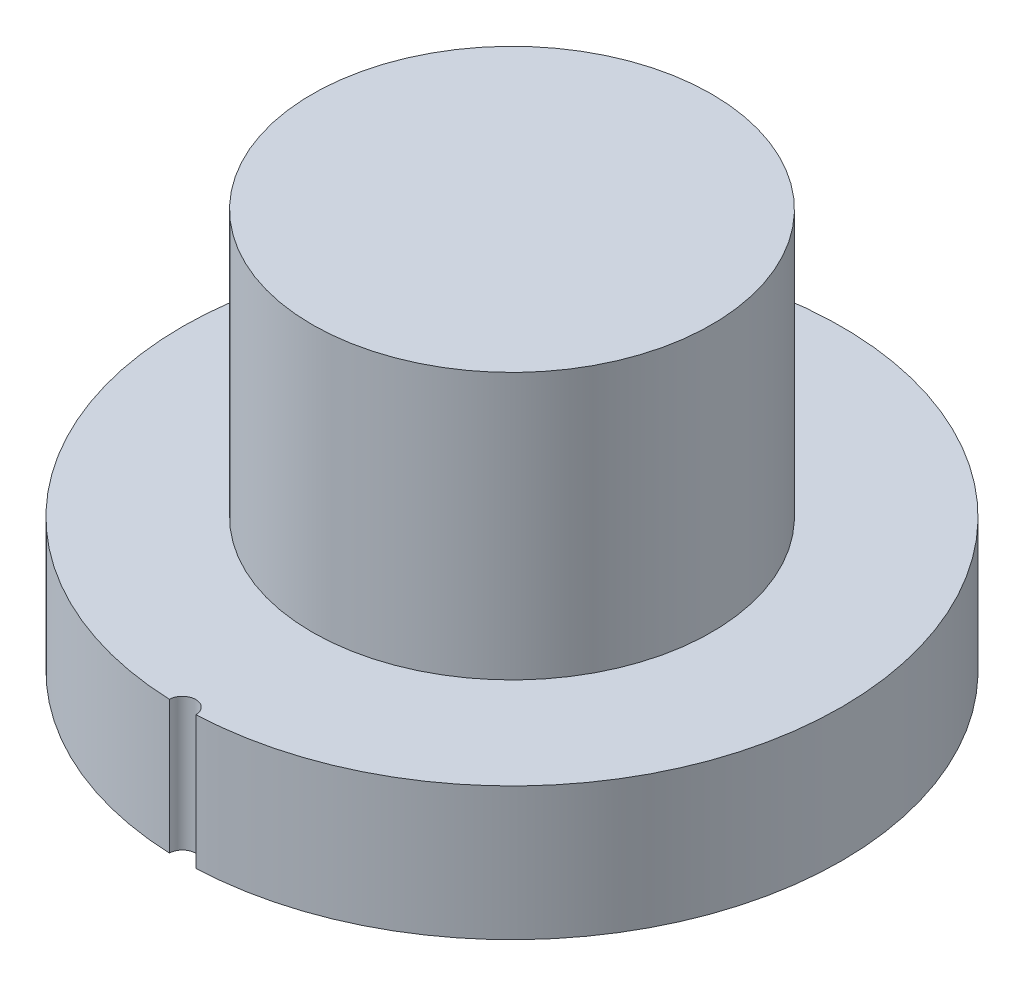
ISO-10303-21;
HEADER;
FILE_DESCRIPTION(('STEP AP214'),'2;1');
FILE_NAME('part.step','',(''),(''),'','','');
FILE_SCHEMA(('AUTOMOTIVE_DESIGN { 1 0 10303 214 1 1 1 1 }'));
ENDSEC;
DATA;
#1=APPLICATION_CONTEXT('core data for automotive mechanical design processes');
#2=APPLICATION_PROTOCOL_DEFINITION('international standard','automotive_design',2000,#1);
#3=PRODUCT_CONTEXT('',#1,'mechanical');
#4=PRODUCT('Part','Part','',(#3));
#5=PRODUCT_RELATED_PRODUCT_CATEGORY('part','',(#4));
#6=PRODUCT_DEFINITION_FORMATION('','',#4);
#7=PRODUCT_DEFINITION_CONTEXT('part definition',#1,'design');
#8=PRODUCT_DEFINITION('design','',#6,#7);
#9=PRODUCT_DEFINITION_SHAPE('','',#8);
#10=(LENGTH_UNIT() NAMED_UNIT(*) SI_UNIT(.MILLI.,.METRE.));
#11=(NAMED_UNIT(*) PLANE_ANGLE_UNIT() SI_UNIT($,.RADIAN.));
#12=(NAMED_UNIT(*) SI_UNIT($,.STERADIAN.) SOLID_ANGLE_UNIT());
#13=UNCERTAINTY_MEASURE_WITH_UNIT(LENGTH_MEASURE(1.E-05),#10,'distance_accuracy_value','');
#14=(GEOMETRIC_REPRESENTATION_CONTEXT(3) GLOBAL_UNCERTAINTY_ASSIGNED_CONTEXT((#13)) GLOBAL_UNIT_ASSIGNED_CONTEXT((#10,
#11,#12)) REPRESENTATION_CONTEXT('',''));
#15=CARTESIAN_POINT('',(0.,0.,0.));
#16=DIRECTION('',(0.,0.,1.));
#17=DIRECTION('',(1.,0.,0.));
#18=AXIS2_PLACEMENT_3D('',#15,#16,#17);
#19=CARTESIAN_POINT('',(0.,0.,0.));
#20=DIRECTION('',(0.,1.,0.));
#21=DIRECTION('',(0.,0.,1.));
#22=AXIS2_PLACEMENT_3D('',#19,#20,#21);
#23=PLANE('',#22);
#24=DIRECTION('',(-1.,0.,0.));
#25=VECTOR('',#24,1.);
#26=CARTESIAN_POINT('',(-8.,0.,-4.));
#27=LINE('',#26,#25);
#28=CARTESIAN_POINT('',(8.,0.,-4.));
#29=VERTEX_POINT('',#28);
#30=CARTESIAN_POINT('',(0.999999999999999,0.,-4.));
#31=VERTEX_POINT('',#30);
#32=EDGE_CURVE('E162',#29,#31,#27,.T.);
#33=ORIENTED_EDGE('',*,*,#32,.T.);
#34=DIRECTION('',(0.,0.,1.));
#35=VECTOR('',#34,1.);
#36=CARTESIAN_POINT('',(1.,0.,4.));
#37=LINE('',#36,#35);
#38=CARTESIAN_POINT('',(1.,0.,4.));
#39=VERTEX_POINT('',#38);
#40=EDGE_CURVE('E144',#31,#39,#37,.T.);
#41=ORIENTED_EDGE('',*,*,#40,.T.);
#42=DIRECTION('',(1.,0.,0.));
#43=VECTOR('',#42,1.);
#44=CARTESIAN_POINT('',(-8.,0.,4.));
#45=LINE('',#44,#43);
#46=CARTESIAN_POINT('',(8.,0.,4.));
#47=VERTEX_POINT('',#46);
#48=EDGE_CURVE('E150',#39,#47,#45,.T.);
#49=ORIENTED_EDGE('',*,*,#48,.T.);
#50=DIRECTION('',(0.,0.,-1.));
#51=VECTOR('',#50,1.);
#52=CARTESIAN_POINT('',(8.,0.,4.));
#53=LINE('',#52,#51);
#54=EDGE_CURVE('E194',#47,#29,#53,.T.);
#55=ORIENTED_EDGE('',*,*,#54,.T.);
#56=EDGE_LOOP('',(#33,#41,#49,#55));
#57=FACE_BOUND('',#56,.T.);
#58=CARTESIAN_POINT('',(0.,0.,0.));
#59=DIRECTION('',(0.,1.,0.));
#60=DIRECTION('',(0.,0.,1.));
#61=AXIS2_PLACEMENT_3D('',#58,#59,#60);
#62=CIRCLE('',#61,12.375);
#63=CARTESIAN_POINT('',(0.499897959182611,0.,12.364898989899));
#64=VERTEX_POINT('',#63);
#65=CARTESIAN_POINT('',(-0.499897959182611,0.,12.364898989899));
#66=VERTEX_POINT('',#65);
#67=EDGE_CURVE('E122',#64,#66,#62,.T.);
#68=ORIENTED_EDGE('',*,*,#67,.F.);
#69=CARTESIAN_POINT('',(0.,0.,12.375));
#70=DIRECTION('',(0.,-1.,0.));
#71=DIRECTION('',(0.,0.,-1.));
#72=AXIS2_PLACEMENT_3D('',#69,#70,#71);
#73=CIRCLE('',#72,0.5);
#74=EDGE_CURVE('E111',#66,#64,#73,.T.);
#75=ORIENTED_EDGE('',*,*,#74,.F.);
#76=EDGE_LOOP('',(#68,#75));
#77=FACE_BOUND('',#76,.T.);
#78=DIRECTION('',(0.,0.,-1.));
#79=VECTOR('',#78,1.);
#80=CARTESIAN_POINT('',(-1.,0.,4.));
#81=LINE('',#80,#79);
#82=CARTESIAN_POINT('',(-1.,0.,4.));
#83=VERTEX_POINT('',#82);
#84=CARTESIAN_POINT('',(-1.,0.,-4.));
#85=VERTEX_POINT('',#84);
#86=EDGE_CURVE('E66',#83,#85,#81,.T.);
#87=ORIENTED_EDGE('',*,*,#86,.T.);
#88=CARTESIAN_POINT('',(-8.,0.,-4.));
#89=VERTEX_POINT('',#88);
#90=EDGE_CURVE('E197',#85,#89,#27,.T.);
#91=ORIENTED_EDGE('',*,*,#90,.T.);
#92=DIRECTION('',(0.,0.,1.));
#93=VECTOR('',#92,1.);
#94=CARTESIAN_POINT('',(-8.,0.,4.));
#95=LINE('',#94,#93);
#96=CARTESIAN_POINT('',(-8.,0.,4.));
#97=VERTEX_POINT('',#96);
#98=EDGE_CURVE('E159',#89,#97,#95,.T.);
#99=ORIENTED_EDGE('',*,*,#98,.T.);
#100=EDGE_CURVE('E158',#97,#83,#45,.T.);
#101=ORIENTED_EDGE('',*,*,#100,.T.);
#102=EDGE_LOOP('',(#87,#91,#99,#101));
#103=FACE_BOUND('',#102,.T.);
#104=ADVANCED_FACE('F37',(#57,#77,#103),#23,.F.);
#105=CARTESIAN_POINT('',(0.,5.,0.));
#106=DIRECTION('',(0.,-1.,0.));
#107=DIRECTION('',(0.,0.,-1.));
#108=AXIS2_PLACEMENT_3D('',#105,#106,#107);
#109=CYLINDRICAL_SURFACE('',#108,12.375);
#110=ORIENTED_EDGE('',*,*,#67,.T.);
#111=DIRECTION('',(0.,-1.,0.));
#112=VECTOR('',#111,1.);
#113=CARTESIAN_POINT('',(-0.499897959182611,2.5,12.364898989899));
#114=LINE('',#113,#112);
#115=CARTESIAN_POINT('',(-0.499897959182638,5.,12.364898989899));
#116=VERTEX_POINT('',#115);
#117=EDGE_CURVE('E114',#116,#66,#114,.T.);
#118=ORIENTED_EDGE('',*,*,#117,.F.);
#119=CARTESIAN_POINT('',(0.,5.,0.));
#120=DIRECTION('',(0.,1.,0.));
#121=DIRECTION('',(0.,0.,1.));
#122=AXIS2_PLACEMENT_3D('',#119,#120,#121);
#123=CIRCLE('',#122,12.375);
#124=CARTESIAN_POINT('',(0.499897959182638,5.,12.364898989899));
#125=VERTEX_POINT('',#124);
#126=EDGE_CURVE('E124',#125,#116,#123,.T.);
#127=ORIENTED_EDGE('',*,*,#126,.F.);
#128=DIRECTION('',(0.,-1.,0.));
#129=VECTOR('',#128,1.);
#130=CARTESIAN_POINT('',(0.499897959182611,2.5,12.364898989899));
#131=LINE('',#130,#129);
#132=EDGE_CURVE('E58',#64,#125,#131,.F.);
#133=ORIENTED_EDGE('',*,*,#132,.F.);
#134=EDGE_LOOP('',(#110,#118,#127,#133));
#135=FACE_BOUND('',#134,.T.);
#136=ADVANCED_FACE('F39',(#135),#109,.T.);
#137=CARTESIAN_POINT('',(0.,5.,0.));
#138=DIRECTION('',(0.,1.,0.));
#139=DIRECTION('',(0.,0.,1.));
#140=AXIS2_PLACEMENT_3D('',#137,#138,#139);
#141=PLANE('',#140);
#142=CARTESIAN_POINT('',(0.,5.,12.375));
#143=DIRECTION('',(0.,1.,0.));
#144=DIRECTION('',(0.,0.,1.));
#145=AXIS2_PLACEMENT_3D('',#142,#143,#144);
#146=CIRCLE('',#145,0.5);
#147=EDGE_CURVE('E118',#116,#125,#146,.F.);
#148=ORIENTED_EDGE('',*,*,#147,.T.);
#149=ORIENTED_EDGE('',*,*,#126,.T.);
#150=EDGE_LOOP('',(#148,#149));
#151=FACE_BOUND('',#150,.T.);
#152=CARTESIAN_POINT('',(0.,5.,0.));
#153=DIRECTION('',(0.,1.,0.));
#154=DIRECTION('',(0.,0.,1.));
#155=AXIS2_PLACEMENT_3D('',#152,#153,#154);
#156=CIRCLE('',#155,7.5);
#157=CARTESIAN_POINT('',(0.,5.,7.5));
#158=VERTEX_POINT('',#157);
#159=EDGE_CURVE('E128',#158,#158,#156,.T.);
#160=ORIENTED_EDGE('',*,*,#159,.F.);
#161=EDGE_LOOP('',(#160));
#162=FACE_BOUND('',#161,.T.);
#163=ADVANCED_FACE('F180',(#151,#162),#141,.T.);
#164=CARTESIAN_POINT('',(0.,15.,0.));
#165=DIRECTION('',(0.,-1.,0.));
#166=DIRECTION('',(0.,0.,-1.));
#167=AXIS2_PLACEMENT_3D('',#164,#165,#166);
#168=CYLINDRICAL_SURFACE('',#167,7.5);
#169=CARTESIAN_POINT('',(0.,10.75,-7.5));
#170=CARTESIAN_POINT('',(-0.0833653601889497,10.7499969332525,-7.49999846371307));
#171=CARTESIAN_POINT('',(-0.166769490302283,10.7430267355485,-7.49859577767346));
#172=CARTESIAN_POINT('',(-0.331220261533529,10.7153522498271,-7.49313548434847));
#173=CARTESIAN_POINT('',(-0.412264976312033,10.6946370507977,-7.48907576790279));
#174=CARTESIAN_POINT('',(-0.569595457894969,10.6401380895688,-7.4787547391743));
#175=CARTESIAN_POINT('',(-0.645885701899701,10.606366844733,-7.47249553615077));
#176=CARTESIAN_POINT('',(-0.791711983296338,10.5267516287331,-7.45845597052971));
#177=CARTESIAN_POINT('',(-0.861248422613717,10.4809083765892,-7.4506756985356));
#178=CARTESIAN_POINT('',(-0.992540215972297,10.3777922585629,-7.43433247994955));
#179=CARTESIAN_POINT('',(-1.05419092673779,10.3203874669132,-7.42576118256521));
#180=CARTESIAN_POINT('',(-1.16705513491204,10.1960613754124,-7.40886270678882));
#181=CARTESIAN_POINT('',(-1.21826781715564,10.1291393329973,-7.40053554750636));
#182=CARTESIAN_POINT('',(-1.30924763002143,9.98692571048219,-7.38498662718923));
#183=CARTESIAN_POINT('',(-1.3489064082988,9.91156353430546,-7.37777561047419));
#184=CARTESIAN_POINT('',(-1.41495849987046,9.75507727149388,-7.36539402087627));
#185=CARTESIAN_POINT('',(-1.44135312365586,9.67395375498048,-7.36022324642942));
#186=CARTESIAN_POINT('',(-1.47978794982724,9.50937345413812,-7.35259207878307));
#187=CARTESIAN_POINT('',(-1.49201174693817,9.42596118378666,-7.35009705160781));
#188=CARTESIAN_POINT('',(-1.50232819158918,9.25823526795349,-7.34799562590941));
#189=CARTESIAN_POINT('',(-1.50042228407025,9.17392171551978,-7.34838893201761));
#190=CARTESIAN_POINT('',(-1.48268185965273,9.0081298179685,-7.35198826722277));
#191=CARTESIAN_POINT('',(-1.46705781036586,8.92662789155903,-7.35515179288145));
#192=CARTESIAN_POINT('',(-1.42265682693458,8.7674258850055,-7.36386819240002));
#193=CARTESIAN_POINT('',(-1.39387926465102,8.68972598662149,-7.36942118036668));
#194=CARTESIAN_POINT('',(-1.32378717551208,8.5397271074446,-7.38233427750612));
#195=CARTESIAN_POINT('',(-1.28238922684817,8.46746818064624,-7.38970634720557));
#196=CARTESIAN_POINT('',(-1.18829036185902,8.33084372504078,-7.40541928159593));
#197=CARTESIAN_POINT('',(-1.13558814653524,8.26647910472327,-7.41376025757549));
#198=CARTESIAN_POINT('',(-1.01924990184088,8.1462558963146,-7.43065531862193));
#199=CARTESIAN_POINT('',(-0.955434241818668,8.09057114821131,-7.43921053816357));
#200=CARTESIAN_POINT('',(-0.819277536093015,7.99066923054817,-7.45543273071613));
#201=CARTESIAN_POINT('',(-0.746936381069085,7.94645220805963,-7.4630996923346));
#202=CARTESIAN_POINT('',(-0.595589080318382,7.87070873616104,-7.47670035241331));
#203=CARTESIAN_POINT('',(-0.516572729377951,7.8392021595332,-7.48263133272408));
#204=CARTESIAN_POINT('',(-0.354223464672998,7.78995928894215,-7.49207113481787));
#205=CARTESIAN_POINT('',(-0.270891075108675,7.77222132688956,-7.49558025000797));
#206=CARTESIAN_POINT('',(-0.103769108440727,7.75126531930858,-7.49974007800301));
#207=CARTESIAN_POINT('',(-0.0200104924883651,7.7478093706896,-7.50043761978705));
#208=CARTESIAN_POINT('',(0.14688740128907,7.75487478841327,-7.49902577895154));
#209=CARTESIAN_POINT('',(0.230026713665689,7.76539536902889,-7.49691655412169));
#210=CARTESIAN_POINT('',(0.39255848991981,7.79991756031593,-7.49015748012026));
#211=CARTESIAN_POINT('',(0.471977922509853,7.82379710274685,-7.4855306460631));
#212=CARTESIAN_POINT('',(0.625685441249499,7.88422597398371,-7.47425328091549));
#213=CARTESIAN_POINT('',(0.699973142456308,7.92077625201524,-7.4676025982134));
#214=CARTESIAN_POINT('',(0.842311760529325,8.00602373597697,-7.45289867299942));
#215=CARTESIAN_POINT('',(0.910275190128281,8.05486417155842,-7.44482925655578));
#216=CARTESIAN_POINT('',(1.03712702867881,8.16311378681092,-7.42822102244824));
#217=CARTESIAN_POINT('',(1.09601446339614,8.2225240995998,-7.41968215452582));
#218=CARTESIAN_POINT('',(1.20396088616126,8.35131002783669,-7.40293955335447));
#219=CARTESIAN_POINT('',(1.25285655367298,8.42082361633201,-7.39474290349956));
#220=CARTESIAN_POINT('',(1.33827813007681,8.56721704203502,-7.37976287694291));
#221=CARTESIAN_POINT('',(1.37480453388435,8.64409658436033,-7.37297944370014));
#222=CARTESIAN_POINT('',(1.43422776237294,8.80265236922432,-7.36165110876574));
#223=CARTESIAN_POINT('',(1.45719524968658,8.88430126181548,-7.3570946230828));
#224=CARTESIAN_POINT('',(1.48906297744079,9.05040018023636,-7.35071155188038));
#225=CARTESIAN_POINT('',(1.49796505233767,9.13484983931402,-7.34888461036667));
#226=CARTESIAN_POINT('',(1.5013813663012,9.30251329681648,-7.34818724447069));
#227=CARTESIAN_POINT('',(1.49615368210634,9.38572172339052,-7.34926378783951));
#228=CARTESIAN_POINT('',(1.47202845615009,9.55004747485754,-7.35413360226921));
#229=CARTESIAN_POINT('',(1.45313102419395,9.63116481654221,-7.35792685150754));
#230=CARTESIAN_POINT('',(1.40231785274843,9.78884156686082,-7.36777896328738));
#231=CARTESIAN_POINT('',(1.37043376007602,9.86541154075362,-7.37383231528246));
#232=CARTESIAN_POINT('',(1.29458196690241,10.0121555811017,-7.38752572461255));
#233=CARTESIAN_POINT('',(1.25061325316232,10.0823291105877,-7.39516591498341));
#234=CARTESIAN_POINT('',(1.15095887217962,10.2155733582255,-7.41133440784838));
#235=CARTESIAN_POINT('',(1.09508683085277,10.2785031479014,-7.41987559364549));
#236=CARTESIAN_POINT('',(0.973596553519712,10.3941793082938,-7.43679122807932));
#237=CARTESIAN_POINT('',(0.907976080730004,10.4469233354759,-7.44516563794777));
#238=CARTESIAN_POINT('',(0.76802644363237,10.5412519659197,-7.46090748581957));
#239=CARTESIAN_POINT('',(0.693613326644752,10.58271400492,-7.46826346828869));
#240=CARTESIAN_POINT('',(0.538749541411099,10.6524791838949,-7.481026876275));
#241=CARTESIAN_POINT('',(0.458304391294689,10.6807941842987,-7.48643605707924));
#242=CARTESIAN_POINT('',(0.314732233385669,10.7179779220671,-7.49364558893056));
#243=CARTESIAN_POINT('',(0.252422496020677,10.7299647905616,-7.49601454737677));
#244=CARTESIAN_POINT('',(0.1267492878151,10.7459768685375,-7.49919231209839));
#245=CARTESIAN_POINT('',(0.0633858506229286,10.7500023317647,-7.50000116809732));
#246=CARTESIAN_POINT('',(0.,10.75,-7.5));
#247=B_SPLINE_CURVE_WITH_KNOTS('',3,(#169,#170,#171,#172,#173,#174,#175,#176,#177,#178,#179,
#180,#181,#182,#183,#184,#185,#186,#187,#188,#189,#190,#191,#192,#193,#194,#195,#196,#197,#198,
#199,#200,#201,#202,#203,#204,#205,#206,#207,#208,#209,#210,#211,#212,#213,#214,#215,#216,#217,
#218,#219,#220,#221,#222,#223,#224,#225,#226,#227,#228,#229,#230,#231,#232,#233,#234,#235,#236,
#237,#238,#239,#240,#241,#242,#243,#244,#245,#246),.UNSPECIFIED.,.T.,.F.,(4,2,2,2,2,2,2,2,2,2,2,
2,2,2,2,2,2,2,2,2,2,2,2,2,2,2,2,2,2,2,2,2,2,2,2,2,2,2,4),(0.,0.249864195991888,
0.499926976036984,0.749750602875512,0.999559353346295,1.25239900516828,1.50525839512105,
1.76041792508884,2.01555224047796,2.26734277655381,2.51910756421838,2.76707590509417,
3.01505608880594,3.26471235305389,3.51439732124505,3.76857378737026,4.0227535130973,
4.27732912281036,4.53187388547054,4.78216103514398,5.03243411486801,5.28045680926085,
5.52849808824033,5.77957599050038,6.03068082518895,6.28560942868838,6.540527830852,
6.79410571549084,7.04765052495622,7.29659583851552,7.54553915238912,7.79387941879665,
8.042240513728,8.29482114358714,8.54745981799395,8.80274245013455,9.05779433276278,
9.24778162934841,9.43776287056494),.UNSPECIFIED.);
#248=CARTESIAN_POINT('',(0.,10.75,-7.5));
#249=VERTEX_POINT('',#248);
#250=EDGE_CURVE('E41',#249,#249,#247,.T.);
#251=ORIENTED_EDGE('',*,*,#250,.T.);
#252=EDGE_LOOP('',(#251));
#253=FACE_BOUND('',#252,.T.);
#254=CARTESIAN_POINT('',(0.,15.,0.));
#255=DIRECTION('',(0.,1.,0.));
#256=DIRECTION('',(0.,0.,1.));
#257=AXIS2_PLACEMENT_3D('',#254,#255,#256);
#258=CIRCLE('',#257,7.5);
#259=CARTESIAN_POINT('',(0.,15.,7.5));
#260=VERTEX_POINT('',#259);
#261=EDGE_CURVE('E126',#260,#260,#258,.T.);
#262=ORIENTED_EDGE('',*,*,#261,.F.);
#263=EDGE_LOOP('',(#262));
#264=FACE_BOUND('',#263,.T.);
#265=ORIENTED_EDGE('',*,*,#159,.T.);
#266=EDGE_LOOP('',(#265));
#267=FACE_BOUND('',#266,.T.);
#268=ADVANCED_FACE('F178',(#253,#264,#267),#168,.T.);
#269=CARTESIAN_POINT('',(0.,15.,0.));
#270=DIRECTION('',(0.,1.,0.));
#271=DIRECTION('',(0.,0.,1.));
#272=AXIS2_PLACEMENT_3D('',#269,#270,#271);
#273=PLANE('',#272);
#274=ORIENTED_EDGE('',*,*,#261,.T.);
#275=EDGE_LOOP('',(#274));
#276=FACE_BOUND('',#275,.T.);
#277=ADVANCED_FACE('F188',(#276),#273,.T.);
#278=CARTESIAN_POINT('',(8.,0.,4.));
#279=DIRECTION('',(0.707106781186546,0.707106781186549,0.));
#280=DIRECTION('',(-0.707106781186549,0.707106781186546,0.));
#281=AXIS2_PLACEMENT_3D('',#278,#279,#280);
#282=PLANE('',#281);
#283=ORIENTED_EDGE('',*,*,#54,.F.);
#284=DIRECTION('',(0.577350269189627,-0.577350269189624,0.577350269189627));
#285=VECTOR('',#284,1.);
#286=CARTESIAN_POINT('',(8.,0.,4.));
#287=LINE('',#286,#285);
#288=CARTESIAN_POINT('',(4.,3.99999999999999,0.));
#289=VERTEX_POINT('',#288);
#290=EDGE_CURVE('E154',#289,#47,#287,.T.);
#291=ORIENTED_EDGE('',*,*,#290,.F.);
#292=DIRECTION('',(0.577350269189627,-0.577350269189624,-0.577350269189627));
#293=VECTOR('',#292,1.);
#294=CARTESIAN_POINT('',(2.66666666666665,5.33333333333333,1.33333333333335));
#295=LINE('',#294,#293);
#296=EDGE_CURVE('E166',#289,#29,#295,.T.);
#297=ORIENTED_EDGE('',*,*,#296,.T.);
#298=EDGE_LOOP('',(#283,#291,#297));
#299=FACE_BOUND('',#298,.T.);
#300=ADVANCED_FACE('F244',(#299),#282,.F.);
#301=CARTESIAN_POINT('',(-8.,0.,-4.));
#302=DIRECTION('',(0.,0.707106781186549,-0.707106781186546));
#303=DIRECTION('',(0.,0.707106781186546,0.707106781186549));
#304=AXIS2_PLACEMENT_3D('',#301,#302,#303);
#305=PLANE('',#304);
#306=DIRECTION('',(0.,0.707106781186546,0.707106781186549));
#307=VECTOR('',#306,1.);
#308=CARTESIAN_POINT('',(-0.999999999999999,0.,-4.));
#309=LINE('',#308,#307);
#310=CARTESIAN_POINT('',(-0.999999999999999,0.8,-3.2));
#311=VERTEX_POINT('',#310);
#312=EDGE_CURVE('E200',#311,#85,#309,.F.);
#313=ORIENTED_EDGE('',*,*,#312,.F.);
#314=DIRECTION('',(-1.,0.,0.));
#315=VECTOR('',#314,1.);
#316=CARTESIAN_POINT('',(-8.,0.8,-3.2));
#317=LINE('',#316,#315);
#318=CARTESIAN_POINT('',(0.999999999999999,0.8,-3.2));
#319=VERTEX_POINT('',#318);
#320=EDGE_CURVE('E204',#311,#319,#317,.F.);
#321=ORIENTED_EDGE('',*,*,#320,.T.);
#322=DIRECTION('',(0.,-0.707106781186546,-0.707106781186549));
#323=VECTOR('',#322,1.);
#324=CARTESIAN_POINT('',(0.999999999999999,0.,-4.));
#325=LINE('',#324,#323);
#326=EDGE_CURVE('E202',#31,#319,#325,.F.);
#327=ORIENTED_EDGE('',*,*,#326,.F.);
#328=ORIENTED_EDGE('',*,*,#32,.F.);
#329=ORIENTED_EDGE('',*,*,#296,.F.);
#330=DIRECTION('',(-1.,0.,0.));
#331=VECTOR('',#330,1.);
#332=CARTESIAN_POINT('',(-8.,3.99999999999999,0.));
#333=LINE('',#332,#331);
#334=CARTESIAN_POINT('',(-4.,3.99999999999998,0.));
#335=VERTEX_POINT('',#334);
#336=EDGE_CURVE('E131',#289,#335,#333,.T.);
#337=ORIENTED_EDGE('',*,*,#336,.T.);
#338=DIRECTION('',(-0.577350269189627,-0.577350269189624,-0.577350269189627));
#339=VECTOR('',#338,1.);
#340=CARTESIAN_POINT('',(-5.33333333333333,2.66666666666666,-1.33333333333333));
#341=LINE('',#340,#339);
#342=EDGE_CURVE('E169',#335,#89,#341,.T.);
#343=ORIENTED_EDGE('',*,*,#342,.T.);
#344=ORIENTED_EDGE('',*,*,#90,.F.);
#345=EDGE_LOOP('',(#313,#321,#327,#328,#329,#337,#343,#344));
#346=FACE_BOUND('',#345,.T.);
#347=ADVANCED_FACE('F247',(#346),#305,.F.);
#348=CARTESIAN_POINT('',(-8.,0.,4.));
#349=DIRECTION('',(-0.707106781186546,0.707106781186549,0.));
#350=DIRECTION('',(-0.707106781186549,-0.707106781186546,0.));
#351=AXIS2_PLACEMENT_3D('',#348,#349,#350);
#352=PLANE('',#351);
#353=ORIENTED_EDGE('',*,*,#98,.F.);
#354=ORIENTED_EDGE('',*,*,#342,.F.);
#355=DIRECTION('',(-0.577350269189627,-0.577350269189624,0.577350269189627));
#356=VECTOR('',#355,1.);
#357=CARTESIAN_POINT('',(-8.,0.,4.));
#358=LINE('',#357,#356);
#359=EDGE_CURVE('E171',#335,#97,#358,.T.);
#360=ORIENTED_EDGE('',*,*,#359,.T.);
#361=EDGE_LOOP('',(#353,#354,#360));
#362=FACE_BOUND('',#361,.T.);
#363=ADVANCED_FACE('F251',(#362),#352,.F.);
#364=CARTESIAN_POINT('',(-8.,0.,4.));
#365=DIRECTION('',(0.,0.707106781186549,0.707106781186546));
#366=DIRECTION('',(0.,-0.707106781186546,0.707106781186549));
#367=AXIS2_PLACEMENT_3D('',#364,#365,#366);
#368=PLANE('',#367);
#369=DIRECTION('',(0.,-0.707106781186546,0.707106781186549));
#370=VECTOR('',#369,1.);
#371=CARTESIAN_POINT('',(-1.,0.,4.));
#372=LINE('',#371,#370);
#373=CARTESIAN_POINT('',(-1.,0.8,3.2));
#374=VERTEX_POINT('',#373);
#375=EDGE_CURVE('E11',#83,#374,#372,.F.);
#376=ORIENTED_EDGE('',*,*,#375,.F.);
#377=ORIENTED_EDGE('',*,*,#100,.F.);
#378=ORIENTED_EDGE('',*,*,#359,.F.);
#379=ORIENTED_EDGE('',*,*,#336,.F.);
#380=ORIENTED_EDGE('',*,*,#290,.T.);
#381=ORIENTED_EDGE('',*,*,#48,.F.);
#382=DIRECTION('',(0.,0.707106781186546,-0.707106781186549));
#383=VECTOR('',#382,1.);
#384=CARTESIAN_POINT('',(1.,0.,4.));
#385=LINE('',#384,#383);
#386=CARTESIAN_POINT('',(1.,0.8,3.2));
#387=VERTEX_POINT('',#386);
#388=EDGE_CURVE('E51',#387,#39,#385,.F.);
#389=ORIENTED_EDGE('',*,*,#388,.F.);
#390=DIRECTION('',(1.,0.,0.));
#391=VECTOR('',#390,1.);
#392=CARTESIAN_POINT('',(-8.,0.8,3.2));
#393=LINE('',#392,#391);
#394=EDGE_CURVE('E135',#387,#374,#393,.F.);
#395=ORIENTED_EDGE('',*,*,#394,.T.);
#396=EDGE_LOOP('',(#376,#377,#378,#379,#380,#381,#389,#395));
#397=FACE_BOUND('',#396,.T.);
#398=ADVANCED_FACE('F152',(#397),#368,.F.);
#399=CARTESIAN_POINT('',(-1.,0.8,4.));
#400=DIRECTION('',(-1.,0.,0.));
#401=DIRECTION('',(0.,0.,1.));
#402=AXIS2_PLACEMENT_3D('',#399,#400,#401);
#403=PLANE('',#402);
#404=DIRECTION('',(0.,0.,-1.));
#405=VECTOR('',#404,1.);
#406=CARTESIAN_POINT('',(-1.,0.8,4.));
#407=LINE('',#406,#405);
#408=EDGE_CURVE('E208',#374,#311,#407,.T.);
#409=ORIENTED_EDGE('',*,*,#408,.T.);
#410=ORIENTED_EDGE('',*,*,#312,.T.);
#411=ORIENTED_EDGE('',*,*,#86,.F.);
#412=ORIENTED_EDGE('',*,*,#375,.T.);
#413=EDGE_LOOP('',(#409,#410,#411,#412));
#414=FACE_BOUND('',#413,.T.);
#415=ADVANCED_FACE('F240',(#414),#403,.T.);
#416=CARTESIAN_POINT('',(1.,0.8,4.));
#417=DIRECTION('',(1.,0.,0.));
#418=DIRECTION('',(0.,0.,-1.));
#419=AXIS2_PLACEMENT_3D('',#416,#417,#418);
#420=PLANE('',#419);
#421=ORIENTED_EDGE('',*,*,#40,.F.);
#422=ORIENTED_EDGE('',*,*,#326,.T.);
#423=DIRECTION('',(0.,0.,1.));
#424=VECTOR('',#423,1.);
#425=CARTESIAN_POINT('',(1.,0.8,4.));
#426=LINE('',#425,#424);
#427=EDGE_CURVE('E147',#319,#387,#426,.T.);
#428=ORIENTED_EDGE('',*,*,#427,.T.);
#429=ORIENTED_EDGE('',*,*,#388,.T.);
#430=EDGE_LOOP('',(#421,#422,#428,#429));
#431=FACE_BOUND('',#430,.T.);
#432=ADVANCED_FACE('F143',(#431),#420,.T.);
#433=CARTESIAN_POINT('',(0.,0.8,0.));
#434=DIRECTION('',(0.,-1.,0.));
#435=DIRECTION('',(0.,0.,-1.));
#436=AXIS2_PLACEMENT_3D('',#433,#434,#435);
#437=PLANE('',#436);
#438=ORIENTED_EDGE('',*,*,#320,.F.);
#439=ORIENTED_EDGE('',*,*,#408,.F.);
#440=ORIENTED_EDGE('',*,*,#394,.F.);
#441=ORIENTED_EDGE('',*,*,#427,.F.);
#442=EDGE_LOOP('',(#438,#439,#440,#441));
#443=FACE_BOUND('',#442,.T.);
#444=ADVANCED_FACE('F226',(#443),#437,.F.);
#445=CARTESIAN_POINT('',(0.,9.25,-12.375));
#446=DIRECTION('',(0.,0.,1.));
#447=DIRECTION('',(1.,0.,0.));
#448=AXIS2_PLACEMENT_3D('',#445,#446,#447);
#449=CYLINDRICAL_SURFACE('',#448,1.5);
#450=CARTESIAN_POINT('',(0.,9.25,0.));
#451=DIRECTION('',(0.,0.,1.));
#452=DIRECTION('',(1.,0.,0.));
#453=AXIS2_PLACEMENT_3D('',#450,#451,#452);
#454=CIRCLE('',#453,1.5);
#455=CARTESIAN_POINT('',(1.5,9.25,0.));
#456=VERTEX_POINT('',#455);
#457=EDGE_CURVE('E213',#456,#456,#454,.T.);
#458=ORIENTED_EDGE('',*,*,#457,.T.);
#459=EDGE_LOOP('',(#458));
#460=FACE_BOUND('',#459,.T.);
#461=ORIENTED_EDGE('',*,*,#250,.F.);
#462=EDGE_LOOP('',(#461));
#463=FACE_BOUND('',#462,.T.);
#464=ADVANCED_FACE('F223',(#460,#463),#449,.F.);
#465=CARTESIAN_POINT('',(0.,9.25,0.));
#466=DIRECTION('',(0.,0.,1.));
#467=DIRECTION('',(1.,0.,0.));
#468=AXIS2_PLACEMENT_3D('',#465,#466,#467);
#469=PLANE('',#468);
#470=ORIENTED_EDGE('',*,*,#457,.F.);
#471=EDGE_LOOP('',(#470));
#472=FACE_BOUND('',#471,.T.);
#473=ADVANCED_FACE('F225',(#472),#469,.F.);
#474=CARTESIAN_POINT('',(0.,15.001,12.375));
#475=DIRECTION('',(0.,-1.,0.));
#476=DIRECTION('',(0.,0.,-1.));
#477=AXIS2_PLACEMENT_3D('',#474,#475,#476);
#478=CYLINDRICAL_SURFACE('',#477,0.5);
#479=ORIENTED_EDGE('',*,*,#132,.T.);
#480=ORIENTED_EDGE('',*,*,#147,.F.);
#481=ORIENTED_EDGE('',*,*,#117,.T.);
#482=ORIENTED_EDGE('',*,*,#74,.T.);
#483=EDGE_LOOP('',(#479,#480,#481,#482));
#484=FACE_BOUND('',#483,.T.);
#485=ADVANCED_FACE('F112',(#484),#478,.F.);
#486=CLOSED_SHELL('',(#104,#136,#163,#268,#277,#300,#347,#363,#398,#415,#432,#444,#464,#473,#485));
#487=MANIFOLD_SOLID_BREP('B2',#486);
#488=ADVANCED_BREP_SHAPE_REPRESENTATION('',(#18,#487),#14);
#489=SHAPE_DEFINITION_REPRESENTATION(#9,#488);
ENDSEC;
END-ISO-10303-21;
